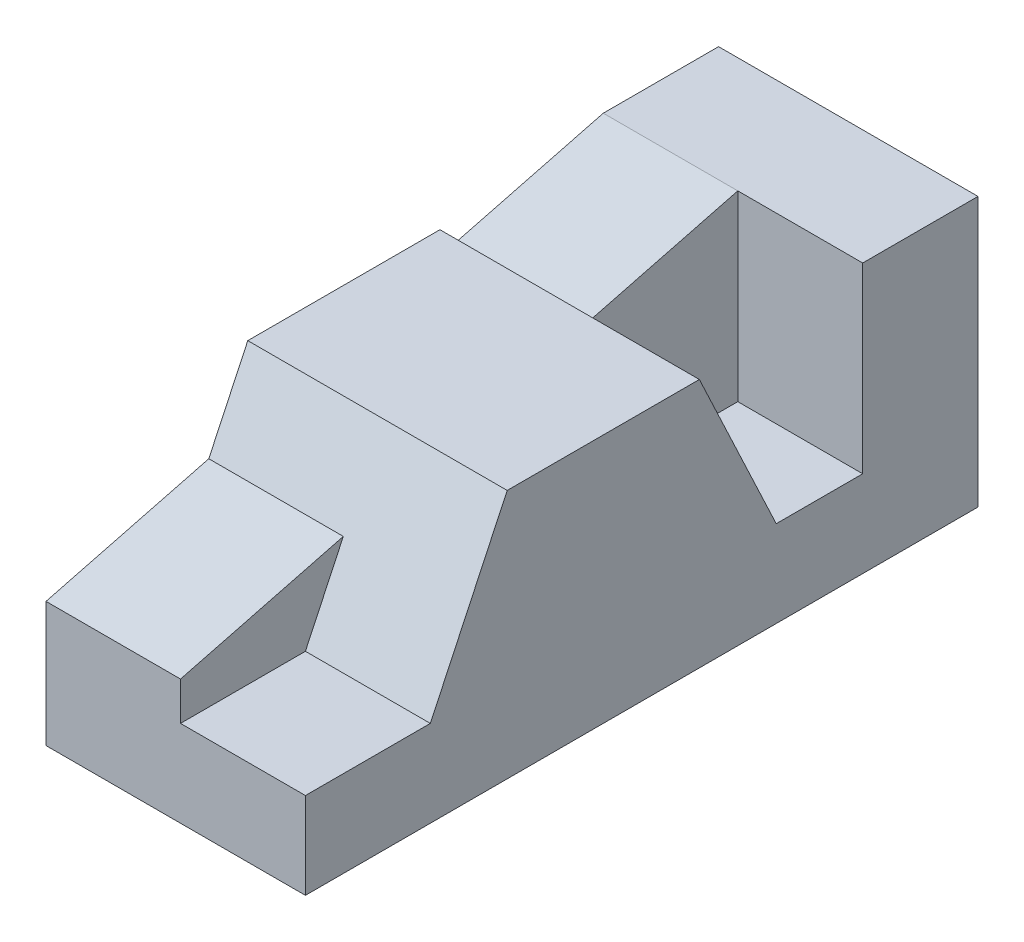
ISO-10303-21;
HEADER;
FILE_DESCRIPTION(('STEP AP214'),'2;1');
FILE_NAME('part.step','',(''),(''),'','','');
FILE_SCHEMA(('AUTOMOTIVE_DESIGN { 1 0 10303 214 1 1 1 1 }'));
ENDSEC;
DATA;
#1=APPLICATION_CONTEXT('core data for automotive mechanical design processes');
#2=APPLICATION_PROTOCOL_DEFINITION('international standard','automotive_design',2000,#1);
#3=PRODUCT_CONTEXT('',#1,'mechanical');
#4=PRODUCT('Part','Part','',(#3));
#5=PRODUCT_RELATED_PRODUCT_CATEGORY('part','',(#4));
#6=PRODUCT_DEFINITION_FORMATION('','',#4);
#7=PRODUCT_DEFINITION_CONTEXT('part definition',#1,'design');
#8=PRODUCT_DEFINITION('design','',#6,#7);
#9=PRODUCT_DEFINITION_SHAPE('','',#8);
#10=(LENGTH_UNIT() NAMED_UNIT(*) SI_UNIT(.MILLI.,.METRE.));
#11=(NAMED_UNIT(*) PLANE_ANGLE_UNIT() SI_UNIT($,.RADIAN.));
#12=(NAMED_UNIT(*) SI_UNIT($,.STERADIAN.) SOLID_ANGLE_UNIT());
#13=UNCERTAINTY_MEASURE_WITH_UNIT(LENGTH_MEASURE(1.E-05),#10,'distance_accuracy_value','');
#14=(GEOMETRIC_REPRESENTATION_CONTEXT(3) GLOBAL_UNCERTAINTY_ASSIGNED_CONTEXT((#13)) GLOBAL_UNIT_ASSIGNED_CONTEXT((#10,
#11,#12)) REPRESENTATION_CONTEXT('',''));
#15=CARTESIAN_POINT('',(0.,0.,0.));
#16=DIRECTION('',(0.,0.,1.));
#17=DIRECTION('',(1.,0.,0.));
#18=AXIS2_PLACEMENT_3D('',#15,#16,#17);
#19=CARTESIAN_POINT('',(-135.,90.,220.));
#20=DIRECTION('',(0.,1.,0.));
#21=DIRECTION('',(0.,0.,1.));
#22=AXIS2_PLACEMENT_3D('',#19,#20,#21);
#23=PLANE('',#22);
#24=DIRECTION('',(0.,0.,1.));
#25=VECTOR('',#24,1.);
#26=CARTESIAN_POINT('',(5.,90.,350.));
#27=LINE('',#26,#25);
#28=CARTESIAN_POINT('',(5.,90.,220.));
#29=VERTEX_POINT('',#28);
#30=CARTESIAN_POINT('',(5.,90.,350.));
#31=VERTEX_POINT('',#30);
#32=EDGE_CURVE('E156',#29,#31,#27,.T.);
#33=ORIENTED_EDGE('',*,*,#32,.T.);
#34=DIRECTION('',(1.,0.,0.));
#35=VECTOR('',#34,1.);
#36=CARTESIAN_POINT('',(-135.,90.,350.));
#37=LINE('',#36,#35);
#38=CARTESIAN_POINT('',(135.,90.,350.));
#39=VERTEX_POINT('',#38);
#40=EDGE_CURVE('E36',#31,#39,#37,.T.);
#41=ORIENTED_EDGE('',*,*,#40,.T.);
#42=DIRECTION('',(0.,0.,1.));
#43=VECTOR('',#42,1.);
#44=CARTESIAN_POINT('',(135.,90.,220.));
#45=LINE('',#44,#43);
#46=CARTESIAN_POINT('',(135.,90.,220.));
#47=VERTEX_POINT('',#46);
#48=EDGE_CURVE('E164',#47,#39,#45,.T.);
#49=ORIENTED_EDGE('',*,*,#48,.F.);
#50=DIRECTION('',(1.,0.,0.));
#51=VECTOR('',#50,1.);
#52=CARTESIAN_POINT('',(-135.,90.,220.));
#53=LINE('',#52,#51);
#54=EDGE_CURVE('E11',#29,#47,#53,.T.);
#55=ORIENTED_EDGE('',*,*,#54,.F.);
#56=EDGE_LOOP('',(#33,#41,#49,#55));
#57=FACE_BOUND('',#56,.T.);
#58=ADVANCED_FACE('F33',(#57),#23,.T.);
#59=CARTESIAN_POINT('',(-135.,260.,140.));
#60=DIRECTION('',(0.,0.42579703632988,0.904818702200994));
#61=DIRECTION('',(0.,-0.904818702200994,0.42579703632988));
#62=AXIS2_PLACEMENT_3D('',#59,#60,#61);
#63=PLANE('',#62);
#64=DIRECTION('',(-1.,0.,0.));
#65=VECTOR('',#64,1.);
#66=CARTESIAN_POINT('',(5.,173.822170900693,180.554272517321));
#67=LINE('',#66,#65);
#68=CARTESIAN_POINT('',(5.,173.822170900693,180.554272517321));
#69=VERTEX_POINT('',#68);
#70=CARTESIAN_POINT('',(-135.,173.822170900693,180.554272517321));
#71=VERTEX_POINT('',#70);
#72=EDGE_CURVE('E144',#69,#71,#67,.T.);
#73=ORIENTED_EDGE('',*,*,#72,.F.);
#74=DIRECTION('',(0.,-0.904818702200994,0.42579703632988));
#75=VECTOR('',#74,1.);
#76=CARTESIAN_POINT('',(5.,90.,220.));
#77=LINE('',#76,#75);
#78=EDGE_CURVE('E145',#69,#29,#77,.T.);
#79=ORIENTED_EDGE('',*,*,#78,.T.);
#80=ORIENTED_EDGE('',*,*,#54,.T.);
#81=DIRECTION('',(0.,-0.904818702200994,0.42579703632988));
#82=VECTOR('',#81,1.);
#83=CARTESIAN_POINT('',(135.,260.,140.));
#84=LINE('',#83,#82);
#85=CARTESIAN_POINT('',(135.,260.,140.));
#86=VERTEX_POINT('',#85);
#87=EDGE_CURVE('E192',#86,#47,#84,.T.);
#88=ORIENTED_EDGE('',*,*,#87,.F.);
#89=DIRECTION('',(1.,0.,0.));
#90=VECTOR('',#89,1.);
#91=CARTESIAN_POINT('',(-135.,260.,140.));
#92=LINE('',#91,#90);
#93=CARTESIAN_POINT('',(-135.,260.,140.));
#94=VERTEX_POINT('',#93);
#95=EDGE_CURVE('E41',#94,#86,#92,.T.);
#96=ORIENTED_EDGE('',*,*,#95,.F.);
#97=DIRECTION('',(0.,-0.904818702200994,0.42579703632988));
#98=VECTOR('',#97,1.);
#99=CARTESIAN_POINT('',(-135.,260.,140.));
#100=LINE('',#99,#98);
#101=EDGE_CURVE('E210',#94,#71,#100,.T.);
#102=ORIENTED_EDGE('',*,*,#101,.T.);
#103=EDGE_LOOP('',(#73,#79,#80,#88,#96,#102));
#104=FACE_BOUND('',#103,.T.);
#105=ADVANCED_FACE('F236',(#104),#63,.T.);
#106=CARTESIAN_POINT('',(-135.,260.,-60.));
#107=DIRECTION('',(0.,1.,0.));
#108=DIRECTION('',(0.,0.,1.));
#109=AXIS2_PLACEMENT_3D('',#106,#107,#108);
#110=PLANE('',#109);
#111=ORIENTED_EDGE('',*,*,#95,.T.);
#112=DIRECTION('',(0.,0.,1.));
#113=VECTOR('',#112,1.);
#114=CARTESIAN_POINT('',(135.,260.,-60.));
#115=LINE('',#114,#113);
#116=CARTESIAN_POINT('',(135.,260.,-60.));
#117=VERTEX_POINT('',#116);
#118=EDGE_CURVE('E189',#117,#86,#115,.T.);
#119=ORIENTED_EDGE('',*,*,#118,.F.);
#120=DIRECTION('',(1.,0.,0.));
#121=VECTOR('',#120,1.);
#122=CARTESIAN_POINT('',(-135.,260.,-60.));
#123=LINE('',#122,#121);
#124=CARTESIAN_POINT('',(-135.,260.,-60.));
#125=VERTEX_POINT('',#124);
#126=EDGE_CURVE('E213',#125,#117,#123,.T.);
#127=ORIENTED_EDGE('',*,*,#126,.F.);
#128=DIRECTION('',(0.,0.,1.));
#129=VECTOR('',#128,1.);
#130=CARTESIAN_POINT('',(-135.,260.,-60.));
#131=LINE('',#130,#129);
#132=EDGE_CURVE('E207',#125,#94,#131,.T.);
#133=ORIENTED_EDGE('',*,*,#132,.T.);
#134=EDGE_LOOP('',(#111,#119,#127,#133));
#135=FACE_BOUND('',#134,.T.);
#136=ADVANCED_FACE('F280',(#135),#110,.T.);
#137=CARTESIAN_POINT('',(-135.,90.,-140.));
#138=DIRECTION('',(0.,0.42579703632988,-0.904818702200994));
#139=DIRECTION('',(0.,0.904818702200994,0.42579703632988));
#140=AXIS2_PLACEMENT_3D('',#137,#138,#139);
#141=PLANE('',#140);
#142=DIRECTION('',(-1.,0.,0.));
#143=VECTOR('',#142,1.);
#144=CARTESIAN_POINT('',(5.,238.634719710669,-70.0542495479203));
#145=LINE('',#144,#143);
#146=CARTESIAN_POINT('',(5.00000000000006,238.634719710669,-70.0542495479203));
#147=VERTEX_POINT('',#146);
#148=CARTESIAN_POINT('',(-135.,238.634719710669,-70.0542495479203));
#149=VERTEX_POINT('',#148);
#150=EDGE_CURVE('E163',#147,#149,#145,.T.);
#151=ORIENTED_EDGE('',*,*,#150,.T.);
#152=DIRECTION('',(0.,0.904818702200994,0.42579703632988));
#153=VECTOR('',#152,1.);
#154=CARTESIAN_POINT('',(-135.,90.,-140.));
#155=LINE('',#154,#153);
#156=EDGE_CURVE('E205',#149,#125,#155,.T.);
#157=ORIENTED_EDGE('',*,*,#156,.T.);
#158=ORIENTED_EDGE('',*,*,#126,.T.);
#159=DIRECTION('',(0.,0.904818702200994,0.42579703632988));
#160=VECTOR('',#159,1.);
#161=CARTESIAN_POINT('',(135.,90.,-140.));
#162=LINE('',#161,#160);
#163=CARTESIAN_POINT('',(135.,90.,-140.));
#164=VERTEX_POINT('',#163);
#165=EDGE_CURVE('E186',#164,#117,#162,.T.);
#166=ORIENTED_EDGE('',*,*,#165,.F.);
#167=DIRECTION('',(1.,0.,0.));
#168=VECTOR('',#167,1.);
#169=CARTESIAN_POINT('',(-135.,90.,-140.));
#170=LINE('',#169,#168);
#171=CARTESIAN_POINT('',(5.00000000000006,90.,-140.));
#172=VERTEX_POINT('',#171);
#173=EDGE_CURVE('E215',#172,#164,#170,.T.);
#174=ORIENTED_EDGE('',*,*,#173,.F.);
#175=DIRECTION('',(0.,0.904818702200994,0.42579703632988));
#176=VECTOR('',#175,1.);
#177=CARTESIAN_POINT('',(5.,90.,-140.));
#178=LINE('',#177,#176);
#179=EDGE_CURVE('E49',#172,#147,#178,.T.);
#180=ORIENTED_EDGE('',*,*,#179,.T.);
#181=EDGE_LOOP('',(#151,#157,#158,#166,#174,#180));
#182=FACE_BOUND('',#181,.T.);
#183=ADVANCED_FACE('F277',(#182),#141,.T.);
#184=CARTESIAN_POINT('',(-135.,90.,-230.));
#185=DIRECTION('',(0.,1.,0.));
#186=DIRECTION('',(0.,0.,1.));
#187=AXIS2_PLACEMENT_3D('',#184,#185,#186);
#188=PLANE('',#187);
#189=DIRECTION('',(0.,0.,1.));
#190=VECTOR('',#189,1.);
#191=CARTESIAN_POINT('',(5.,90.,-230.));
#192=LINE('',#191,#190);
#193=CARTESIAN_POINT('',(5.00000000000006,90.,-230.));
#194=VERTEX_POINT('',#193);
#195=EDGE_CURVE('E57',#194,#172,#192,.T.);
#196=ORIENTED_EDGE('',*,*,#195,.T.);
#197=ORIENTED_EDGE('',*,*,#173,.T.);
#198=DIRECTION('',(0.,0.,1.));
#199=VECTOR('',#198,1.);
#200=CARTESIAN_POINT('',(135.,90.,-230.));
#201=LINE('',#200,#199);
#202=CARTESIAN_POINT('',(135.,90.,-230.));
#203=VERTEX_POINT('',#202);
#204=EDGE_CURVE('E183',#203,#164,#201,.T.);
#205=ORIENTED_EDGE('',*,*,#204,.F.);
#206=DIRECTION('',(1.,0.,0.));
#207=VECTOR('',#206,1.);
#208=CARTESIAN_POINT('',(-135.,90.,-230.));
#209=LINE('',#208,#207);
#210=EDGE_CURVE('E217',#194,#203,#209,.T.);
#211=ORIENTED_EDGE('',*,*,#210,.F.);
#212=EDGE_LOOP('',(#196,#197,#205,#211));
#213=FACE_BOUND('',#212,.T.);
#214=ADVANCED_FACE('F273',(#213),#188,.T.);
#215=CARTESIAN_POINT('',(-135.,280.,-230.));
#216=DIRECTION('',(0.,0.,1.));
#217=DIRECTION('',(0.,-1.,0.));
#218=AXIS2_PLACEMENT_3D('',#215,#216,#217);
#219=PLANE('',#218);
#220=DIRECTION('',(0.,-1.,0.));
#221=VECTOR('',#220,1.);
#222=CARTESIAN_POINT('',(5.,280.,-230.));
#223=LINE('',#222,#221);
#224=CARTESIAN_POINT('',(5.,280.,-230.));
#225=VERTEX_POINT('',#224);
#226=EDGE_CURVE('E261',#225,#194,#223,.T.);
#227=ORIENTED_EDGE('',*,*,#226,.T.);
#228=ORIENTED_EDGE('',*,*,#210,.T.);
#229=DIRECTION('',(0.,-1.,0.));
#230=VECTOR('',#229,1.);
#231=CARTESIAN_POINT('',(135.,280.,-230.));
#232=LINE('',#231,#230);
#233=CARTESIAN_POINT('',(135.,280.,-230.));
#234=VERTEX_POINT('',#233);
#235=EDGE_CURVE('E180',#234,#203,#232,.T.);
#236=ORIENTED_EDGE('',*,*,#235,.F.);
#237=DIRECTION('',(1.,0.,0.));
#238=VECTOR('',#237,1.);
#239=CARTESIAN_POINT('',(-135.,280.,-230.));
#240=LINE('',#239,#238);
#241=EDGE_CURVE('E222',#225,#234,#240,.T.);
#242=ORIENTED_EDGE('',*,*,#241,.F.);
#243=EDGE_LOOP('',(#227,#228,#236,#242));
#244=FACE_BOUND('',#243,.T.);
#245=ADVANCED_FACE('F268',(#244),#219,.T.);
#246=CARTESIAN_POINT('',(-135.,280.,-350.));
#247=DIRECTION('',(0.,1.,0.));
#248=DIRECTION('',(0.,0.,1.));
#249=AXIS2_PLACEMENT_3D('',#246,#247,#248);
#250=PLANE('',#249);
#251=CARTESIAN_POINT('',(-135.,280.,-230.));
#252=VERTEX_POINT('',#251);
#253=EDGE_CURVE('E219',#252,#225,#240,.T.);
#254=ORIENTED_EDGE('',*,*,#253,.T.);
#255=ORIENTED_EDGE('',*,*,#241,.T.);
#256=DIRECTION('',(0.,0.,1.));
#257=VECTOR('',#256,1.);
#258=CARTESIAN_POINT('',(135.,280.,-350.));
#259=LINE('',#258,#257);
#260=CARTESIAN_POINT('',(135.,280.,-350.));
#261=VERTEX_POINT('',#260);
#262=EDGE_CURVE('E177',#261,#234,#259,.T.);
#263=ORIENTED_EDGE('',*,*,#262,.F.);
#264=DIRECTION('',(1.,0.,0.));
#265=VECTOR('',#264,1.);
#266=CARTESIAN_POINT('',(-135.,280.,-350.));
#267=LINE('',#266,#265);
#268=CARTESIAN_POINT('',(-135.,280.,-350.));
#269=VERTEX_POINT('',#268);
#270=EDGE_CURVE('E223',#269,#261,#267,.T.);
#271=ORIENTED_EDGE('',*,*,#270,.F.);
#272=DIRECTION('',(0.,0.,1.));
#273=VECTOR('',#272,1.);
#274=CARTESIAN_POINT('',(-135.,280.,-350.));
#275=LINE('',#274,#273);
#276=EDGE_CURVE('E203',#269,#252,#275,.T.);
#277=ORIENTED_EDGE('',*,*,#276,.T.);
#278=EDGE_LOOP('',(#254,#255,#263,#271,#277));
#279=FACE_BOUND('',#278,.T.);
#280=ADVANCED_FACE('F252',(#279),#250,.T.);
#281=CARTESIAN_POINT('',(-135.,1.2490009027033E-13,-350.));
#282=DIRECTION('',(0.,0.,-1.));
#283=DIRECTION('',(0.,1.,0.));
#284=AXIS2_PLACEMENT_3D('',#281,#282,#283);
#285=PLANE('',#284);
#286=ORIENTED_EDGE('',*,*,#270,.T.);
#287=DIRECTION('',(0.,1.,0.));
#288=VECTOR('',#287,1.);
#289=CARTESIAN_POINT('',(135.,1.2490009027033E-13,-350.));
#290=LINE('',#289,#288);
#291=CARTESIAN_POINT('',(135.,1.2490009027033E-13,-350.));
#292=VERTEX_POINT('',#291);
#293=EDGE_CURVE('E174',#292,#261,#290,.T.);
#294=ORIENTED_EDGE('',*,*,#293,.F.);
#295=DIRECTION('',(1.,0.,0.));
#296=VECTOR('',#295,1.);
#297=CARTESIAN_POINT('',(-135.,1.2490009027033E-13,-350.));
#298=LINE('',#297,#296);
#299=CARTESIAN_POINT('',(-135.,1.2490009027033E-13,-350.));
#300=VERTEX_POINT('',#299);
#301=EDGE_CURVE('E225',#300,#292,#298,.T.);
#302=ORIENTED_EDGE('',*,*,#301,.F.);
#303=DIRECTION('',(0.,1.,0.));
#304=VECTOR('',#303,1.);
#305=CARTESIAN_POINT('',(-135.,1.2490009027033E-13,-350.));
#306=LINE('',#305,#304);
#307=EDGE_CURVE('E200',#300,#269,#306,.T.);
#308=ORIENTED_EDGE('',*,*,#307,.T.);
#309=EDGE_LOOP('',(#286,#294,#302,#308));
#310=FACE_BOUND('',#309,.T.);
#311=ADVANCED_FACE('F250',(#310),#285,.T.);
#312=CARTESIAN_POINT('',(-135.,0.,350.));
#313=DIRECTION('',(0.,-1.,0.));
#314=DIRECTION('',(0.,0.,-1.));
#315=AXIS2_PLACEMENT_3D('',#312,#313,#314);
#316=PLANE('',#315);
#317=ORIENTED_EDGE('',*,*,#301,.T.);
#318=DIRECTION('',(0.,0.,-1.));
#319=VECTOR('',#318,1.);
#320=CARTESIAN_POINT('',(135.,0.,350.));
#321=LINE('',#320,#319);
#322=CARTESIAN_POINT('',(135.,0.,350.));
#323=VERTEX_POINT('',#322);
#324=EDGE_CURVE('E171',#323,#292,#321,.T.);
#325=ORIENTED_EDGE('',*,*,#324,.F.);
#326=DIRECTION('',(1.,0.,0.));
#327=VECTOR('',#326,1.);
#328=CARTESIAN_POINT('',(-135.,0.,350.));
#329=LINE('',#328,#327);
#330=CARTESIAN_POINT('',(-135.,0.,350.));
#331=VERTEX_POINT('',#330);
#332=EDGE_CURVE('E226',#331,#323,#329,.T.);
#333=ORIENTED_EDGE('',*,*,#332,.F.);
#334=DIRECTION('',(0.,0.,-1.));
#335=VECTOR('',#334,1.);
#336=CARTESIAN_POINT('',(-135.,0.,350.));
#337=LINE('',#336,#335);
#338=EDGE_CURVE('E197',#331,#300,#337,.T.);
#339=ORIENTED_EDGE('',*,*,#338,.T.);
#340=EDGE_LOOP('',(#317,#325,#333,#339));
#341=FACE_BOUND('',#340,.T.);
#342=ADVANCED_FACE('F246',(#341),#316,.T.);
#343=CARTESIAN_POINT('',(-135.,90.,350.));
#344=DIRECTION('',(0.,0.,1.));
#345=DIRECTION('',(1.,0.,0.));
#346=AXIS2_PLACEMENT_3D('',#343,#344,#345);
#347=PLANE('',#346);
#348=ORIENTED_EDGE('',*,*,#332,.T.);
#349=DIRECTION('',(0.,-1.,0.));
#350=VECTOR('',#349,1.);
#351=CARTESIAN_POINT('',(135.,90.,350.));
#352=LINE('',#351,#350);
#353=EDGE_CURVE('E168',#39,#323,#352,.T.);
#354=ORIENTED_EDGE('',*,*,#353,.F.);
#355=ORIENTED_EDGE('',*,*,#40,.F.);
#356=DIRECTION('',(0.,1.,0.));
#357=VECTOR('',#356,1.);
#358=CARTESIAN_POINT('',(5.,90.,350.));
#359=LINE('',#358,#357);
#360=CARTESIAN_POINT('',(5.,130.,350.));
#361=VERTEX_POINT('',#360);
#362=EDGE_CURVE('E151',#31,#361,#359,.T.);
#363=ORIENTED_EDGE('',*,*,#362,.T.);
#364=DIRECTION('',(-1.,0.,0.));
#365=VECTOR('',#364,1.);
#366=CARTESIAN_POINT('',(5.,130.,350.));
#367=LINE('',#366,#365);
#368=CARTESIAN_POINT('',(-135.,130.,350.));
#369=VERTEX_POINT('',#368);
#370=EDGE_CURVE('E133',#361,#369,#367,.T.);
#371=ORIENTED_EDGE('',*,*,#370,.T.);
#372=DIRECTION('',(0.,-1.,0.));
#373=VECTOR('',#372,1.);
#374=CARTESIAN_POINT('',(-135.,90.,350.));
#375=LINE('',#374,#373);
#376=EDGE_CURVE('E195',#369,#331,#375,.T.);
#377=ORIENTED_EDGE('',*,*,#376,.T.);
#378=EDGE_LOOP('',(#348,#354,#355,#363,#371,#377));
#379=FACE_BOUND('',#378,.T.);
#380=ADVANCED_FACE('F154',(#379),#347,.T.);
#381=CARTESIAN_POINT('',(-135.,0.,0.));
#382=DIRECTION('',(1.,0.,0.));
#383=DIRECTION('',(0.,0.,-1.));
#384=AXIS2_PLACEMENT_3D('',#381,#382,#383);
#385=PLANE('',#384);
#386=ORIENTED_EDGE('',*,*,#156,.F.);
#387=DIRECTION('',(0.,0.250382821968518,-0.968146911611601));
#388=VECTOR('',#387,1.);
#389=CARTESIAN_POINT('',(-135.,238.634719710669,-70.0542495479203));
#390=LINE('',#389,#388);
#391=EDGE_CURVE('E256',#149,#252,#390,.T.);
#392=ORIENTED_EDGE('',*,*,#391,.T.);
#393=ORIENTED_EDGE('',*,*,#276,.F.);
#394=ORIENTED_EDGE('',*,*,#307,.F.);
#395=ORIENTED_EDGE('',*,*,#338,.F.);
#396=ORIENTED_EDGE('',*,*,#376,.F.);
#397=DIRECTION('',(0.,0.250382821968518,-0.968146911611601));
#398=VECTOR('',#397,1.);
#399=CARTESIAN_POINT('',(-135.,130.,350.));
#400=LINE('',#399,#398);
#401=EDGE_CURVE('E140',#369,#71,#400,.T.);
#402=ORIENTED_EDGE('',*,*,#401,.T.);
#403=ORIENTED_EDGE('',*,*,#101,.F.);
#404=ORIENTED_EDGE('',*,*,#132,.F.);
#405=EDGE_LOOP('',(#386,#392,#393,#394,#395,#396,#402,#403,#404));
#406=FACE_BOUND('',#405,.T.);
#407=ADVANCED_FACE('F240',(#406),#385,.F.);
#408=CARTESIAN_POINT('',(135.,0.,0.));
#409=DIRECTION('',(1.,0.,0.));
#410=DIRECTION('',(0.,0.,-1.));
#411=AXIS2_PLACEMENT_3D('',#408,#409,#410);
#412=PLANE('',#411);
#413=ORIENTED_EDGE('',*,*,#48,.T.);
#414=ORIENTED_EDGE('',*,*,#353,.T.);
#415=ORIENTED_EDGE('',*,*,#324,.T.);
#416=ORIENTED_EDGE('',*,*,#293,.T.);
#417=ORIENTED_EDGE('',*,*,#262,.T.);
#418=ORIENTED_EDGE('',*,*,#235,.T.);
#419=ORIENTED_EDGE('',*,*,#204,.T.);
#420=ORIENTED_EDGE('',*,*,#165,.T.);
#421=ORIENTED_EDGE('',*,*,#118,.T.);
#422=ORIENTED_EDGE('',*,*,#87,.T.);
#423=EDGE_LOOP('',(#413,#414,#415,#416,#417,#418,#419,#420,#421,#422));
#424=FACE_BOUND('',#423,.T.);
#425=ADVANCED_FACE('F232',(#424),#412,.T.);
#426=CARTESIAN_POINT('',(5.,130.,350.));
#427=DIRECTION('',(0.,0.968146911611601,0.250382821968518));
#428=DIRECTION('',(0.,-0.250382821968518,0.968146911611601));
#429=AXIS2_PLACEMENT_3D('',#426,#427,#428);
#430=PLANE('',#429);
#431=ORIENTED_EDGE('',*,*,#401,.F.);
#432=ORIENTED_EDGE('',*,*,#370,.F.);
#433=DIRECTION('',(0.,0.250382821968518,-0.968146911611601));
#434=VECTOR('',#433,1.);
#435=CARTESIAN_POINT('',(5.,130.,350.));
#436=LINE('',#435,#434);
#437=EDGE_CURVE('E137',#361,#69,#436,.T.);
#438=ORIENTED_EDGE('',*,*,#437,.T.);
#439=ORIENTED_EDGE('',*,*,#72,.T.);
#440=EDGE_LOOP('',(#431,#432,#438,#439));
#441=FACE_BOUND('',#440,.T.);
#442=ADVANCED_FACE('F135',(#441),#430,.T.);
#443=CARTESIAN_POINT('',(5.,0.,0.));
#444=DIRECTION('',(1.,0.,0.));
#445=DIRECTION('',(0.,0.,-1.));
#446=AXIS2_PLACEMENT_3D('',#443,#444,#445);
#447=PLANE('',#446);
#448=ORIENTED_EDGE('',*,*,#32,.F.);
#449=ORIENTED_EDGE('',*,*,#78,.F.);
#450=ORIENTED_EDGE('',*,*,#437,.F.);
#451=ORIENTED_EDGE('',*,*,#362,.F.);
#452=EDGE_LOOP('',(#448,#449,#450,#451));
#453=FACE_BOUND('',#452,.T.);
#454=ADVANCED_FACE('F150',(#453),#447,.T.);
#455=CARTESIAN_POINT('',(5.,238.634719710669,-70.0542495479203));
#456=DIRECTION('',(0.,0.968146911611601,0.250382821968518));
#457=DIRECTION('',(0.,-0.250382821968518,0.968146911611601));
#458=AXIS2_PLACEMENT_3D('',#455,#456,#457);
#459=PLANE('',#458);
#460=ORIENTED_EDGE('',*,*,#391,.F.);
#461=ORIENTED_EDGE('',*,*,#150,.F.);
#462=DIRECTION('',(0.,0.250382821968518,-0.968146911611601));
#463=VECTOR('',#462,1.);
#464=CARTESIAN_POINT('',(5.,238.634719710669,-70.0542495479203));
#465=LINE('',#464,#463);
#466=EDGE_CURVE('E258',#147,#225,#465,.T.);
#467=ORIENTED_EDGE('',*,*,#466,.T.);
#468=ORIENTED_EDGE('',*,*,#253,.F.);
#469=EDGE_LOOP('',(#460,#461,#467,#468));
#470=FACE_BOUND('',#469,.T.);
#471=ADVANCED_FACE('F275',(#470),#459,.T.);
#472=CARTESIAN_POINT('',(5.00000000000006,0.,0.));
#473=DIRECTION('',(1.,0.,0.));
#474=DIRECTION('',(0.,0.,-1.));
#475=AXIS2_PLACEMENT_3D('',#472,#473,#474);
#476=PLANE('',#475);
#477=ORIENTED_EDGE('',*,*,#466,.F.);
#478=ORIENTED_EDGE('',*,*,#179,.F.);
#479=ORIENTED_EDGE('',*,*,#195,.F.);
#480=ORIENTED_EDGE('',*,*,#226,.F.);
#481=EDGE_LOOP('',(#477,#478,#479,#480));
#482=FACE_BOUND('',#481,.T.);
#483=ADVANCED_FACE('F274',(#482),#476,.T.);
#484=CLOSED_SHELL('',(#58,#105,#136,#183,#214,#245,#280,#311,#342,#380,#407,#425,#442,#454,#471,#483));
#485=MANIFOLD_SOLID_BREP('B2',#484);
#486=ADVANCED_BREP_SHAPE_REPRESENTATION('',(#18,#485),#14);
#487=SHAPE_DEFINITION_REPRESENTATION(#9,#486);
ENDSEC;
END-ISO-10303-21;
